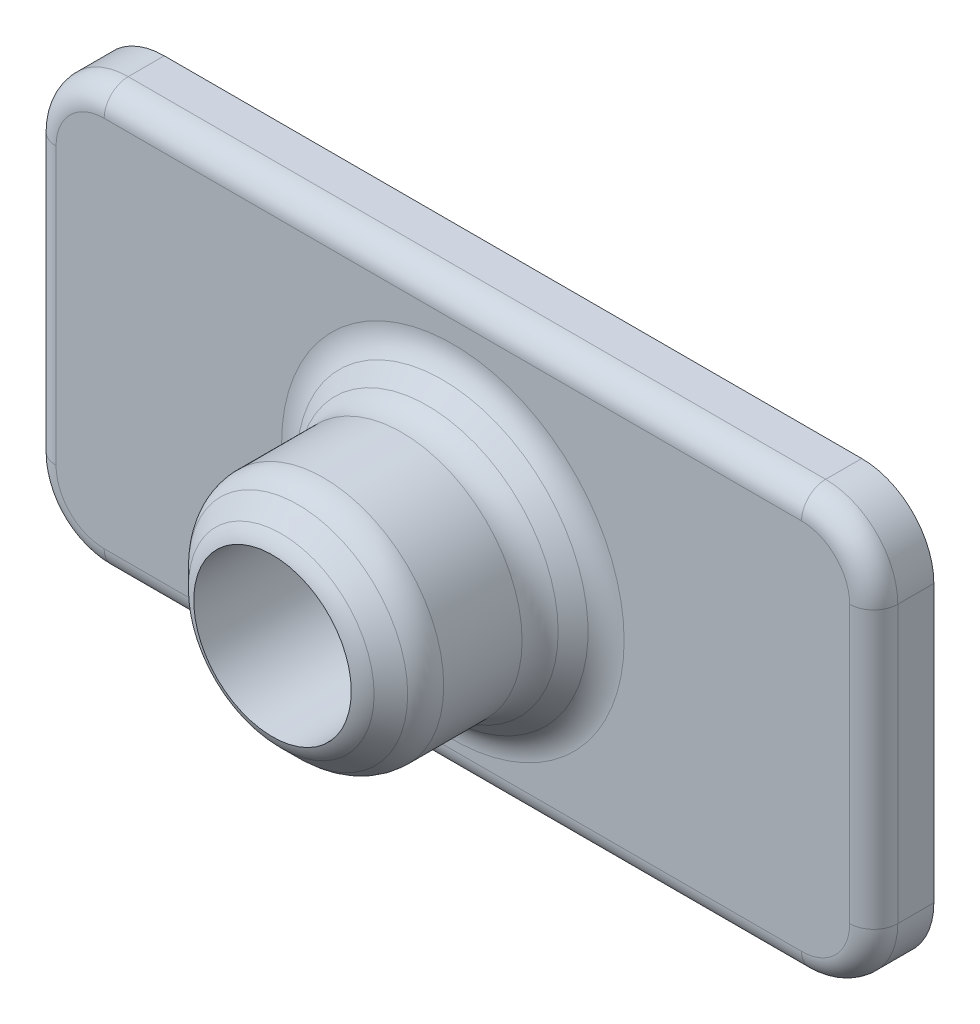
ISO-10303-21;
HEADER;
FILE_DESCRIPTION(('STEP AP214'),'2;1');
FILE_NAME('part.step','',(''),(''),'','','');
FILE_SCHEMA(('AUTOMOTIVE_DESIGN { 1 0 10303 214 1 1 1 1 }'));
ENDSEC;
DATA;
#1=APPLICATION_CONTEXT('core data for automotive mechanical design processes');
#2=APPLICATION_PROTOCOL_DEFINITION('international standard','automotive_design',2000,#1);
#3=PRODUCT_CONTEXT('',#1,'mechanical');
#4=PRODUCT('Part','Part','',(#3));
#5=PRODUCT_RELATED_PRODUCT_CATEGORY('part','',(#4));
#6=PRODUCT_DEFINITION_FORMATION('','',#4);
#7=PRODUCT_DEFINITION_CONTEXT('part definition',#1,'design');
#8=PRODUCT_DEFINITION('design','',#6,#7);
#9=PRODUCT_DEFINITION_SHAPE('','',#8);
#10=(LENGTH_UNIT() NAMED_UNIT(*) SI_UNIT(.MILLI.,.METRE.));
#11=(NAMED_UNIT(*) PLANE_ANGLE_UNIT() SI_UNIT($,.RADIAN.));
#12=(NAMED_UNIT(*) SI_UNIT($,.STERADIAN.) SOLID_ANGLE_UNIT());
#13=UNCERTAINTY_MEASURE_WITH_UNIT(LENGTH_MEASURE(1.E-05),#10,'distance_accuracy_value','');
#14=(GEOMETRIC_REPRESENTATION_CONTEXT(3) GLOBAL_UNCERTAINTY_ASSIGNED_CONTEXT((#13)) GLOBAL_UNIT_ASSIGNED_CONTEXT((#10,
#11,#12)) REPRESENTATION_CONTEXT('',''));
#15=CARTESIAN_POINT('',(0.,0.,0.));
#16=DIRECTION('',(0.,0.,1.));
#17=DIRECTION('',(1.,0.,0.));
#18=AXIS2_PLACEMENT_3D('',#15,#16,#17);
#19=CARTESIAN_POINT('',(-115.000000000002,-75.0000000000001,5.));
#20=DIRECTION('',(1.,0.,0.));
#21=DIRECTION('',(0.,0.,-1.));
#22=AXIS2_PLACEMENT_3D('',#19,#20,#21);
#23=PLANE('',#22);
#24=DIRECTION('',(0.,0.,-1.));
#25=VECTOR('',#24,1.);
#26=CARTESIAN_POINT('',(-115.000000000002,-69.0000000000001,5.));
#27=LINE('',#26,#25);
#28=CARTESIAN_POINT('',(-115.000000000002,-69.0000000000001,0.));
#29=VERTEX_POINT('',#28);
#30=CARTESIAN_POINT('',(-115.000000000002,-69.0000000000001,3.));
#31=VERTEX_POINT('',#30);
#32=EDGE_CURVE('E177',#29,#31,#27,.F.);
#33=ORIENTED_EDGE('',*,*,#32,.T.);
#34=DIRECTION('',(0.,-1.,0.));
#35=VECTOR('',#34,1.);
#36=CARTESIAN_POINT('',(-115.000000000002,-75.0000000000001,3.));
#37=LINE('',#36,#35);
#38=CARTESIAN_POINT('',(-115.000000000002,-46.0000000000001,3.));
#39=VERTEX_POINT('',#38);
#40=EDGE_CURVE('E11',#31,#39,#37,.F.);
#41=ORIENTED_EDGE('',*,*,#40,.T.);
#42=DIRECTION('',(0.,0.,-1.));
#43=VECTOR('',#42,1.);
#44=CARTESIAN_POINT('',(-115.000000000002,-46.0000000000001,5.));
#45=LINE('',#44,#43);
#46=CARTESIAN_POINT('',(-115.000000000002,-46.0000000000001,0.));
#47=VERTEX_POINT('',#46);
#48=EDGE_CURVE('E175',#39,#47,#45,.T.);
#49=ORIENTED_EDGE('',*,*,#48,.T.);
#50=DIRECTION('',(0.,-1.,0.));
#51=VECTOR('',#50,1.);
#52=CARTESIAN_POINT('',(-115.000000000002,-75.0000000000001,0.));
#53=LINE('',#52,#51);
#54=EDGE_CURVE('E261',#47,#29,#53,.T.);
#55=ORIENTED_EDGE('',*,*,#54,.T.);
#56=EDGE_LOOP('',(#33,#41,#49,#55));
#57=FACE_BOUND('',#56,.T.);
#58=ADVANCED_FACE('F39',(#57),#23,.F.);
#59=CARTESIAN_POINT('',(-115.000000000002,-75.0000000000001,5.));
#60=DIRECTION('',(0.,1.,0.));
#61=DIRECTION('',(0.,0.,1.));
#62=AXIS2_PLACEMENT_3D('',#59,#60,#61);
#63=PLANE('',#62);
#64=DIRECTION('',(0.,0.,-1.));
#65=VECTOR('',#64,1.);
#66=CARTESIAN_POINT('',(-51.0000000000018,-75.0000000000001,5.));
#67=LINE('',#66,#65);
#68=CARTESIAN_POINT('',(-51.0000000000018,-75.0000000000001,0.));
#69=VERTEX_POINT('',#68);
#70=CARTESIAN_POINT('',(-51.0000000000018,-75.0000000000001,3.));
#71=VERTEX_POINT('',#70);
#72=EDGE_CURVE('E173',#69,#71,#67,.F.);
#73=ORIENTED_EDGE('',*,*,#72,.T.);
#74=DIRECTION('',(1.,0.,0.));
#75=VECTOR('',#74,1.);
#76=CARTESIAN_POINT('',(-115.000000000002,-75.0000000000001,3.));
#77=LINE('',#76,#75);
#78=CARTESIAN_POINT('',(-109.000000000002,-75.0000000000001,3.));
#79=VERTEX_POINT('',#78);
#80=EDGE_CURVE('E63',#71,#79,#77,.F.);
#81=ORIENTED_EDGE('',*,*,#80,.T.);
#82=DIRECTION('',(0.,0.,-1.));
#83=VECTOR('',#82,1.);
#84=CARTESIAN_POINT('',(-109.000000000002,-75.0000000000001,5.));
#85=LINE('',#84,#83);
#86=CARTESIAN_POINT('',(-109.000000000002,-75.0000000000001,0.));
#87=VERTEX_POINT('',#86);
#88=EDGE_CURVE('E171',#79,#87,#85,.T.);
#89=ORIENTED_EDGE('',*,*,#88,.T.);
#90=DIRECTION('',(1.,0.,0.));
#91=VECTOR('',#90,1.);
#92=CARTESIAN_POINT('',(-115.000000000002,-75.0000000000001,0.));
#93=LINE('',#92,#91);
#94=EDGE_CURVE('E161',#87,#69,#93,.T.);
#95=ORIENTED_EDGE('',*,*,#94,.T.);
#96=EDGE_LOOP('',(#73,#81,#89,#95));
#97=FACE_BOUND('',#96,.T.);
#98=ADVANCED_FACE('F268',(#97),#63,.F.);
#99=CARTESIAN_POINT('',(-45.0000000000018,-40.0000000000001,5.));
#100=DIRECTION('',(-1.,0.,0.));
#101=DIRECTION('',(0.,0.,1.));
#102=AXIS2_PLACEMENT_3D('',#99,#100,#101);
#103=PLANE('',#102);
#104=DIRECTION('',(0.,0.,-1.));
#105=VECTOR('',#104,1.);
#106=CARTESIAN_POINT('',(-45.0000000000018,-46.0000000000001,5.));
#107=LINE('',#106,#105);
#108=CARTESIAN_POINT('',(-45.0000000000018,-46.0000000000001,0.));
#109=VERTEX_POINT('',#108);
#110=CARTESIAN_POINT('',(-45.0000000000018,-46.0000000000001,3.));
#111=VERTEX_POINT('',#110);
#112=EDGE_CURVE('E148',#109,#111,#107,.F.);
#113=ORIENTED_EDGE('',*,*,#112,.T.);
#114=DIRECTION('',(0.,1.,0.));
#115=VECTOR('',#114,1.);
#116=CARTESIAN_POINT('',(-45.0000000000018,-40.0000000000001,3.));
#117=LINE('',#116,#115);
#118=CARTESIAN_POINT('',(-45.0000000000018,-69.0000000000001,3.));
#119=VERTEX_POINT('',#118);
#120=EDGE_CURVE('E223',#111,#119,#117,.F.);
#121=ORIENTED_EDGE('',*,*,#120,.T.);
#122=DIRECTION('',(0.,0.,-1.));
#123=VECTOR('',#122,1.);
#124=CARTESIAN_POINT('',(-45.0000000000018,-69.0000000000001,5.));
#125=LINE('',#124,#123);
#126=CARTESIAN_POINT('',(-45.0000000000018,-69.0000000000001,0.));
#127=VERTEX_POINT('',#126);
#128=EDGE_CURVE('E152',#119,#127,#125,.T.);
#129=ORIENTED_EDGE('',*,*,#128,.T.);
#130=DIRECTION('',(0.,1.,0.));
#131=VECTOR('',#130,1.);
#132=CARTESIAN_POINT('',(-45.0000000000018,-40.0000000000001,0.));
#133=LINE('',#132,#131);
#134=EDGE_CURVE('E158',#127,#109,#133,.T.);
#135=ORIENTED_EDGE('',*,*,#134,.T.);
#136=EDGE_LOOP('',(#113,#121,#129,#135));
#137=FACE_BOUND('',#136,.T.);
#138=ADVANCED_FACE('F306',(#137),#103,.F.);
#139=CARTESIAN_POINT('',(-115.000000000002,-40.0000000000001,5.));
#140=DIRECTION('',(0.,-1.,0.));
#141=DIRECTION('',(0.,0.,-1.));
#142=AXIS2_PLACEMENT_3D('',#139,#140,#141);
#143=PLANE('',#142);
#144=DIRECTION('',(0.,0.,-1.));
#145=VECTOR('',#144,1.);
#146=CARTESIAN_POINT('',(-109.000000000002,-40.0000000000001,5.));
#147=LINE('',#146,#145);
#148=CARTESIAN_POINT('',(-109.000000000002,-40.0000000000001,0.));
#149=VERTEX_POINT('',#148);
#150=CARTESIAN_POINT('',(-109.000000000002,-40.0000000000001,3.));
#151=VERTEX_POINT('',#150);
#152=EDGE_CURVE('E142',#149,#151,#147,.F.);
#153=ORIENTED_EDGE('',*,*,#152,.T.);
#154=DIRECTION('',(-1.,0.,0.));
#155=VECTOR('',#154,1.);
#156=CARTESIAN_POINT('',(-115.000000000002,-40.0000000000001,3.));
#157=LINE('',#156,#155);
#158=CARTESIAN_POINT('',(-51.0000000000018,-40.0000000000001,3.));
#159=VERTEX_POINT('',#158);
#160=EDGE_CURVE('E138',#151,#159,#157,.F.);
#161=ORIENTED_EDGE('',*,*,#160,.T.);
#162=DIRECTION('',(0.,0.,-1.));
#163=VECTOR('',#162,1.);
#164=CARTESIAN_POINT('',(-51.0000000000018,-40.0000000000001,5.));
#165=LINE('',#164,#163);
#166=CARTESIAN_POINT('',(-51.0000000000018,-40.0000000000001,0.));
#167=VERTEX_POINT('',#166);
#168=EDGE_CURVE('E130',#159,#167,#165,.T.);
#169=ORIENTED_EDGE('',*,*,#168,.T.);
#170=DIRECTION('',(-1.,0.,0.));
#171=VECTOR('',#170,1.);
#172=CARTESIAN_POINT('',(-115.000000000002,-40.0000000000001,0.));
#173=LINE('',#172,#171);
#174=EDGE_CURVE('E135',#167,#149,#173,.T.);
#175=ORIENTED_EDGE('',*,*,#174,.T.);
#176=EDGE_LOOP('',(#153,#161,#169,#175));
#177=FACE_BOUND('',#176,.T.);
#178=ADVANCED_FACE('F133',(#177),#143,.F.);
#179=CARTESIAN_POINT('',(0.,0.,5.));
#180=DIRECTION('',(0.,0.,-1.));
#181=DIRECTION('',(-1.,0.,0.));
#182=AXIS2_PLACEMENT_3D('',#179,#180,#181);
#183=PLANE('',#182);
#184=DIRECTION('',(-1.,0.,0.));
#185=VECTOR('',#184,1.);
#186=CARTESIAN_POINT('',(0.,-42.0000000000001,5.));
#187=LINE('',#186,#185);
#188=CARTESIAN_POINT('',(-51.0000000000018,-42.0000000000001,5.));
#189=VERTEX_POINT('',#188);
#190=CARTESIAN_POINT('',(-109.000000000002,-42.0000000000001,5.));
#191=VERTEX_POINT('',#190);
#192=EDGE_CURVE('E212',#189,#191,#187,.T.);
#193=ORIENTED_EDGE('',*,*,#192,.T.);
#194=CARTESIAN_POINT('',(-109.000000000002,-46.0000000000001,5.));
#195=DIRECTION('',(0.,0.,-1.));
#196=DIRECTION('',(-1.,0.,0.));
#197=AXIS2_PLACEMENT_3D('',#194,#195,#196);
#198=CIRCLE('',#197,4.);
#199=CARTESIAN_POINT('',(-113.000000000002,-46.0000000000001,5.));
#200=VERTEX_POINT('',#199);
#201=EDGE_CURVE('E214',#191,#200,#198,.F.);
#202=ORIENTED_EDGE('',*,*,#201,.T.);
#203=DIRECTION('',(0.,-1.,0.));
#204=VECTOR('',#203,1.);
#205=CARTESIAN_POINT('',(-113.000000000002,0.,5.));
#206=LINE('',#205,#204);
#207=CARTESIAN_POINT('',(-113.000000000002,-69.0000000000001,5.));
#208=VERTEX_POINT('',#207);
#209=EDGE_CURVE('E200',#200,#208,#206,.T.);
#210=ORIENTED_EDGE('',*,*,#209,.T.);
#211=CARTESIAN_POINT('',(-109.000000000002,-69.0000000000001,5.));
#212=DIRECTION('',(0.,0.,-1.));
#213=DIRECTION('',(-1.,0.,0.));
#214=AXIS2_PLACEMENT_3D('',#211,#212,#213);
#215=CIRCLE('',#214,4.);
#216=CARTESIAN_POINT('',(-109.000000000002,-73.0000000000001,5.));
#217=VERTEX_POINT('',#216);
#218=EDGE_CURVE('E202',#208,#217,#215,.F.);
#219=ORIENTED_EDGE('',*,*,#218,.T.);
#220=DIRECTION('',(1.,0.,0.));
#221=VECTOR('',#220,1.);
#222=CARTESIAN_POINT('',(0.,-73.0000000000001,5.));
#223=LINE('',#222,#221);
#224=CARTESIAN_POINT('',(-51.0000000000018,-73.0000000000001,5.));
#225=VERTEX_POINT('',#224);
#226=EDGE_CURVE('E204',#217,#225,#223,.T.);
#227=ORIENTED_EDGE('',*,*,#226,.T.);
#228=CARTESIAN_POINT('',(-51.0000000000018,-69.0000000000001,5.));
#229=DIRECTION('',(0.,0.,-1.));
#230=DIRECTION('',(-1.,0.,0.));
#231=AXIS2_PLACEMENT_3D('',#228,#229,#230);
#232=CIRCLE('',#231,4.);
#233=CARTESIAN_POINT('',(-47.0000000000018,-69.0000000000001,5.));
#234=VERTEX_POINT('',#233);
#235=EDGE_CURVE('E206',#225,#234,#232,.F.);
#236=ORIENTED_EDGE('',*,*,#235,.T.);
#237=DIRECTION('',(0.,1.,0.));
#238=VECTOR('',#237,1.);
#239=CARTESIAN_POINT('',(-47.0000000000018,0.,5.));
#240=LINE('',#239,#238);
#241=CARTESIAN_POINT('',(-47.0000000000018,-46.0000000000001,5.));
#242=VERTEX_POINT('',#241);
#243=EDGE_CURVE('E208',#234,#242,#240,.T.);
#244=ORIENTED_EDGE('',*,*,#243,.T.);
#245=CARTESIAN_POINT('',(-51.0000000000018,-46.0000000000001,5.));
#246=DIRECTION('',(0.,0.,-1.));
#247=DIRECTION('',(-1.,0.,0.));
#248=AXIS2_PLACEMENT_3D('',#245,#246,#247);
#249=CIRCLE('',#248,4.);
#250=EDGE_CURVE('E210',#242,#189,#249,.F.);
#251=ORIENTED_EDGE('',*,*,#250,.T.);
#252=EDGE_LOOP('',(#193,#202,#210,#219,#227,#236,#244,#251));
#253=FACE_BOUND('',#252,.T.);
#254=CARTESIAN_POINT('',(-80.0000000000018,-58.0000000000001,5.));
#255=DIRECTION('',(0.,0.,-1.));
#256=DIRECTION('',(-1.,0.,0.));
#257=AXIS2_PLACEMENT_3D('',#254,#255,#256);
#258=CIRCLE('',#257,14.2426406871193);
#259=CARTESIAN_POINT('',(-94.2426406871211,-58.0000000000001,5.));
#260=VERTEX_POINT('',#259);
#261=EDGE_CURVE('E191',#260,#260,#258,.T.);
#262=ORIENTED_EDGE('',*,*,#261,.T.);
#263=EDGE_LOOP('',(#262));
#264=FACE_BOUND('',#263,.T.);
#265=ADVANCED_FACE('F309',(#253,#264),#183,.F.);
#266=CARTESIAN_POINT('',(0.,0.,0.));
#267=DIRECTION('',(0.,0.,-1.));
#268=DIRECTION('',(-1.,0.,0.));
#269=AXIS2_PLACEMENT_3D('',#266,#267,#268);
#270=PLANE('',#269);
#271=ORIENTED_EDGE('',*,*,#174,.F.);
#272=CARTESIAN_POINT('',(-51.0000000000018,-46.0000000000001,0.));
#273=DIRECTION('',(0.,0.,-1.));
#274=DIRECTION('',(-1.,0.,0.));
#275=AXIS2_PLACEMENT_3D('',#272,#273,#274);
#276=CIRCLE('',#275,6.);
#277=EDGE_CURVE('E145',#167,#109,#276,.T.);
#278=ORIENTED_EDGE('',*,*,#277,.T.);
#279=ORIENTED_EDGE('',*,*,#134,.F.);
#280=CARTESIAN_POINT('',(-51.0000000000018,-69.0000000000001,0.));
#281=DIRECTION('',(0.,0.,-1.));
#282=DIRECTION('',(-1.,0.,0.));
#283=AXIS2_PLACEMENT_3D('',#280,#281,#282);
#284=CIRCLE('',#283,6.);
#285=EDGE_CURVE('E153',#127,#69,#284,.T.);
#286=ORIENTED_EDGE('',*,*,#285,.T.);
#287=ORIENTED_EDGE('',*,*,#94,.F.);
#288=CARTESIAN_POINT('',(-109.000000000002,-69.0000000000001,0.));
#289=DIRECTION('',(0.,0.,-1.));
#290=DIRECTION('',(-1.,0.,0.));
#291=AXIS2_PLACEMENT_3D('',#288,#289,#290);
#292=CIRCLE('',#291,6.);
#293=EDGE_CURVE('E166',#87,#29,#292,.T.);
#294=ORIENTED_EDGE('',*,*,#293,.T.);
#295=ORIENTED_EDGE('',*,*,#54,.F.);
#296=CARTESIAN_POINT('',(-109.000000000002,-46.0000000000001,0.));
#297=DIRECTION('',(0.,0.,-1.));
#298=DIRECTION('',(-1.,0.,0.));
#299=AXIS2_PLACEMENT_3D('',#296,#297,#298);
#300=CIRCLE('',#299,6.);
#301=EDGE_CURVE('E141',#47,#149,#300,.T.);
#302=ORIENTED_EDGE('',*,*,#301,.T.);
#303=EDGE_LOOP('',(#271,#278,#279,#286,#287,#294,#295,#302));
#304=FACE_BOUND('',#303,.T.);
#305=ADVANCED_FACE('F155',(#304),#270,.T.);
#306=CARTESIAN_POINT('',(-51.0000000000018,-46.0000000000001,5.));
#307=DIRECTION('',(0.,0.,-1.));
#308=DIRECTION('',(-1.,0.,0.));
#309=AXIS2_PLACEMENT_3D('',#306,#307,#308);
#310=CYLINDRICAL_SURFACE('',#309,6.);
#311=ORIENTED_EDGE('',*,*,#168,.F.);
#312=CARTESIAN_POINT('',(-51.0000000000018,-46.0000000000001,3.));
#313=DIRECTION('',(0.,0.,-1.));
#314=DIRECTION('',(-1.,0.,0.));
#315=AXIS2_PLACEMENT_3D('',#312,#313,#314);
#316=CIRCLE('',#315,6.);
#317=EDGE_CURVE('E221',#159,#111,#316,.T.);
#318=ORIENTED_EDGE('',*,*,#317,.T.);
#319=ORIENTED_EDGE('',*,*,#112,.F.);
#320=ORIENTED_EDGE('',*,*,#277,.F.);
#321=EDGE_LOOP('',(#311,#318,#319,#320));
#322=FACE_BOUND('',#321,.T.);
#323=ADVANCED_FACE('F146',(#322),#310,.T.);
#324=CARTESIAN_POINT('',(-51.0000000000018,-69.0000000000001,5.));
#325=DIRECTION('',(0.,0.,-1.));
#326=DIRECTION('',(-1.,0.,0.));
#327=AXIS2_PLACEMENT_3D('',#324,#325,#326);
#328=CYLINDRICAL_SURFACE('',#327,6.);
#329=ORIENTED_EDGE('',*,*,#128,.F.);
#330=CARTESIAN_POINT('',(-51.0000000000018,-69.0000000000001,3.));
#331=DIRECTION('',(0.,0.,-1.));
#332=DIRECTION('',(-1.,0.,0.));
#333=AXIS2_PLACEMENT_3D('',#330,#331,#332);
#334=CIRCLE('',#333,6.);
#335=EDGE_CURVE('E225',#119,#71,#334,.T.);
#336=ORIENTED_EDGE('',*,*,#335,.T.);
#337=ORIENTED_EDGE('',*,*,#72,.F.);
#338=ORIENTED_EDGE('',*,*,#285,.F.);
#339=EDGE_LOOP('',(#329,#336,#337,#338));
#340=FACE_BOUND('',#339,.T.);
#341=ADVANCED_FACE('F273',(#340),#328,.T.);
#342=CARTESIAN_POINT('',(-109.000000000002,-69.0000000000001,5.));
#343=DIRECTION('',(0.,0.,-1.));
#344=DIRECTION('',(-1.,0.,0.));
#345=AXIS2_PLACEMENT_3D('',#342,#343,#344);
#346=CYLINDRICAL_SURFACE('',#345,6.);
#347=ORIENTED_EDGE('',*,*,#88,.F.);
#348=CARTESIAN_POINT('',(-109.000000000002,-69.0000000000001,3.));
#349=DIRECTION('',(0.,0.,-1.));
#350=DIRECTION('',(-1.,0.,0.));
#351=AXIS2_PLACEMENT_3D('',#348,#349,#350);
#352=CIRCLE('',#351,6.);
#353=EDGE_CURVE('E48',#79,#31,#352,.T.);
#354=ORIENTED_EDGE('',*,*,#353,.T.);
#355=ORIENTED_EDGE('',*,*,#32,.F.);
#356=ORIENTED_EDGE('',*,*,#293,.F.);
#357=EDGE_LOOP('',(#347,#354,#355,#356));
#358=FACE_BOUND('',#357,.T.);
#359=ADVANCED_FACE('F344',(#358),#346,.T.);
#360=CARTESIAN_POINT('',(-109.000000000002,-46.0000000000001,5.));
#361=DIRECTION('',(0.,0.,-1.));
#362=DIRECTION('',(-1.,0.,0.));
#363=AXIS2_PLACEMENT_3D('',#360,#361,#362);
#364=CYLINDRICAL_SURFACE('',#363,6.);
#365=ORIENTED_EDGE('',*,*,#48,.F.);
#366=CARTESIAN_POINT('',(-109.000000000002,-46.0000000000001,3.));
#367=DIRECTION('',(0.,0.,-1.));
#368=DIRECTION('',(-1.,0.,0.));
#369=AXIS2_PLACEMENT_3D('',#366,#367,#368);
#370=CIRCLE('',#369,6.);
#371=EDGE_CURVE('E217',#39,#151,#370,.T.);
#372=ORIENTED_EDGE('',*,*,#371,.T.);
#373=ORIENTED_EDGE('',*,*,#152,.F.);
#374=ORIENTED_EDGE('',*,*,#301,.F.);
#375=EDGE_LOOP('',(#365,#372,#373,#374));
#376=FACE_BOUND('',#375,.T.);
#377=ADVANCED_FACE('F292',(#376),#364,.T.);
#378=CARTESIAN_POINT('',(-80.0000000000018,-58.0000000000001,20.));
#379=DIRECTION('',(0.,0.,-1.));
#380=DIRECTION('',(-1.,0.,0.));
#381=AXIS2_PLACEMENT_3D('',#378,#379,#380);
#382=CYLINDRICAL_SURFACE('',#381,9.99999999999999);
#383=CARTESIAN_POINT('',(-80.0000000000018,-58.0000000000001,15.7573593128807));
#384=DIRECTION('',(0.,0.,1.));
#385=DIRECTION('',(1.,0.,0.));
#386=AXIS2_PLACEMENT_3D('',#383,#384,#385);
#387=CIRCLE('',#386,9.99999999999999);
#388=CARTESIAN_POINT('',(-70.0000000000018,-58.0000000000001,15.7573593128807));
#389=VERTEX_POINT('',#388);
#390=EDGE_CURVE('E188',#389,#389,#387,.F.);
#391=ORIENTED_EDGE('',*,*,#390,.T.);
#392=EDGE_LOOP('',(#391));
#393=FACE_BOUND('',#392,.T.);
#394=CARTESIAN_POINT('',(-80.0000000000018,-58.0000000000001,9.24264068711929));
#395=DIRECTION('',(0.,0.,1.));
#396=DIRECTION('',(1.,0.,0.));
#397=AXIS2_PLACEMENT_3D('',#394,#395,#396);
#398=CIRCLE('',#397,9.99999999999999);
#399=CARTESIAN_POINT('',(-70.0000000000018,-58.0000000000001,9.24264068711929));
#400=VERTEX_POINT('',#399);
#401=EDGE_CURVE('E185',#400,#400,#398,.T.);
#402=ORIENTED_EDGE('',*,*,#401,.T.);
#403=EDGE_LOOP('',(#402));
#404=FACE_BOUND('',#403,.T.);
#405=ADVANCED_FACE('F349',(#393,#404),#382,.T.);
#406=CARTESIAN_POINT('',(-80.0000000000018,-58.0000000000001,20.));
#407=DIRECTION('',(0.,0.,-1.));
#408=DIRECTION('',(-1.,0.,0.));
#409=AXIS2_PLACEMENT_3D('',#406,#407,#408);
#410=CYLINDRICAL_SURFACE('',#409,6.55);
#411=CARTESIAN_POINT('',(-80.0000000000018,-58.0000000000001,20.));
#412=DIRECTION('',(0.,0.,1.));
#413=DIRECTION('',(1.,0.,0.));
#414=AXIS2_PLACEMENT_3D('',#411,#412,#413);
#415=CIRCLE('',#414,6.55);
#416=CARTESIAN_POINT('',(-73.4500000000019,-58.0000000000001,20.));
#417=VERTEX_POINT('',#416);
#418=EDGE_CURVE('E256',#417,#417,#415,.T.);
#419=ORIENTED_EDGE('',*,*,#418,.T.);
#420=EDGE_LOOP('',(#419));
#421=FACE_BOUND('',#420,.T.);
#422=CARTESIAN_POINT('',(-80.0000000000018,-58.0000000000001,5.));
#423=DIRECTION('',(0.,0.,1.));
#424=DIRECTION('',(1.,0.,0.));
#425=AXIS2_PLACEMENT_3D('',#422,#423,#424);
#426=CIRCLE('',#425,6.55);
#427=CARTESIAN_POINT('',(-73.4500000000019,-58.0000000000001,5.));
#428=VERTEX_POINT('',#427);
#429=EDGE_CURVE('E250',#428,#428,#426,.T.);
#430=ORIENTED_EDGE('',*,*,#429,.F.);
#431=EDGE_LOOP('',(#430));
#432=FACE_BOUND('',#431,.T.);
#433=ADVANCED_FACE('F372',(#421,#432),#410,.F.);
#434=ORIENTED_EDGE('',*,*,#429,.T.);
#435=EDGE_LOOP('',(#434));
#436=FACE_BOUND('',#435,.T.);
#437=ADVANCED_FACE('F313',(#436),#183,.F.);
#438=CARTESIAN_POINT('',(-80.0000000000018,-58.0000000000001,20.));
#439=DIRECTION('',(0.,0.,-1.));
#440=DIRECTION('',(-1.,0.,0.));
#441=AXIS2_PLACEMENT_3D('',#438,#439,#440);
#442=CONICAL_SURFACE('',#441,7.00000000000001,0.785398163397444);
#443=CARTESIAN_POINT('',(-80.0000000000018,-58.0000000000001,19.2742270751637));
#444=DIRECTION('',(0.,0.,-1.));
#445=DIRECTION('',(-1.,0.,0.));
#446=AXIS2_PLACEMENT_3D('',#443,#444,#445);
#447=CIRCLE('',#446,7.72577292483635);
#448=CARTESIAN_POINT('',(-87.7257729248382,-58.0000000000001,19.2742270751637));
#449=VERTEX_POINT('',#448);
#450=EDGE_CURVE('E182',#449,#449,#447,.T.);
#451=ORIENTED_EDGE('',*,*,#450,.T.);
#452=EDGE_LOOP('',(#451));
#453=FACE_BOUND('',#452,.T.);
#454=CARTESIAN_POINT('',(-80.0000000000018,-58.0000000000001,17.8786796564403));
#455=DIRECTION('',(0.,0.,-1.));
#456=DIRECTION('',(-1.,0.,0.));
#457=AXIS2_PLACEMENT_3D('',#454,#455,#456);
#458=CIRCLE('',#457,9.12132034355964);
#459=CARTESIAN_POINT('',(-89.1213203435615,-58.0000000000001,17.8786796564403));
#460=VERTEX_POINT('',#459);
#461=EDGE_CURVE('E179',#460,#460,#458,.F.);
#462=ORIENTED_EDGE('',*,*,#461,.T.);
#463=EDGE_LOOP('',(#462));
#464=FACE_BOUND('',#463,.T.);
#465=ADVANCED_FACE('F351',(#453,#464),#442,.T.);
#466=CARTESIAN_POINT('',(-80.0000000000018,-58.0000000000001,8.00000000000002));
#467=DIRECTION('',(0.,0.,-1.));
#468=DIRECTION('',(-1.,0.,0.));
#469=AXIS2_PLACEMENT_3D('',#466,#467,#468);
#470=CONICAL_SURFACE('',#469,9.99999999999999,0.785398163397444);
#471=CARTESIAN_POINT('',(-80.0000000000018,-58.0000000000001,5.87867965644037));
#472=DIRECTION('',(0.,0.,-1.));
#473=DIRECTION('',(-1.,0.,0.));
#474=AXIS2_PLACEMENT_3D('',#471,#472,#473);
#475=CIRCLE('',#474,12.1213203435596);
#476=CARTESIAN_POINT('',(-92.1213203435615,-58.0000000000001,5.87867965644037));
#477=VERTEX_POINT('',#476);
#478=EDGE_CURVE('E197',#477,#477,#475,.F.);
#479=ORIENTED_EDGE('',*,*,#478,.T.);
#480=EDGE_LOOP('',(#479));
#481=FACE_BOUND('',#480,.T.);
#482=CARTESIAN_POINT('',(-80.0000000000018,-58.0000000000001,7.12132034355966));
#483=DIRECTION('',(0.,0.,-1.));
#484=DIRECTION('',(-1.,0.,0.));
#485=AXIS2_PLACEMENT_3D('',#482,#483,#484);
#486=CIRCLE('',#485,10.8786796564403);
#487=CARTESIAN_POINT('',(-90.8786796564422,-58.0000000000001,7.12132034355966));
#488=VERTEX_POINT('',#487);
#489=EDGE_CURVE('E194',#488,#488,#486,.T.);
#490=ORIENTED_EDGE('',*,*,#489,.T.);
#491=EDGE_LOOP('',(#490));
#492=FACE_BOUND('',#491,.T.);
#493=ADVANCED_FACE('F357',(#481,#492),#470,.T.);
#494=CARTESIAN_POINT('',(-80.0000000000018,-58.0000000000001,17.152906731604));
#495=DIRECTION('',(0.,0.,1.));
#496=DIRECTION('',(1.,0.,0.));
#497=AXIS2_PLACEMENT_3D('',#494,#495,#496);
#498=TOROIDAL_SURFACE('',#497,5.6044525812767,3.);
#499=ORIENTED_EDGE('',*,*,#450,.F.);
#500=EDGE_LOOP('',(#499));
#501=FACE_BOUND('',#500,.T.);
#502=ORIENTED_EDGE('',*,*,#418,.F.);
#503=EDGE_LOOP('',(#502));
#504=FACE_BOUND('',#503,.T.);
#505=ADVANCED_FACE('F328',(#501,#504),#498,.T.);
#506=CARTESIAN_POINT('',(-80.0000000000018,-58.0000000000001,15.7573593128807));
#507=DIRECTION('',(0.,0.,1.));
#508=DIRECTION('',(1.,0.,0.));
#509=AXIS2_PLACEMENT_3D('',#506,#507,#508);
#510=TOROIDAL_SURFACE('',#509,6.99999999999999,3.);
#511=ORIENTED_EDGE('',*,*,#461,.F.);
#512=EDGE_LOOP('',(#511));
#513=FACE_BOUND('',#512,.T.);
#514=ORIENTED_EDGE('',*,*,#390,.F.);
#515=EDGE_LOOP('',(#514));
#516=FACE_BOUND('',#515,.T.);
#517=ADVANCED_FACE('F319',(#513,#516),#510,.T.);
#518=CARTESIAN_POINT('',(-80.0000000000018,-58.0000000000001,8.));
#519=DIRECTION('',(0.,0.,-1.));
#520=DIRECTION('',(-1.,0.,0.));
#521=AXIS2_PLACEMENT_3D('',#518,#519,#520);
#522=TOROIDAL_SURFACE('',#521,14.2426406871193,3.);
#523=ORIENTED_EDGE('',*,*,#478,.F.);
#524=EDGE_LOOP('',(#523));
#525=FACE_BOUND('',#524,.T.);
#526=ORIENTED_EDGE('',*,*,#261,.F.);
#527=EDGE_LOOP('',(#526));
#528=FACE_BOUND('',#527,.T.);
#529=ADVANCED_FACE('F316',(#525,#528),#522,.F.);
#530=CARTESIAN_POINT('',(-80.0000000000018,-58.0000000000001,9.24264068711929));
#531=DIRECTION('',(0.,0.,1.));
#532=DIRECTION('',(1.,0.,0.));
#533=AXIS2_PLACEMENT_3D('',#530,#531,#532);
#534=TOROIDAL_SURFACE('',#533,13.,3.);
#535=ORIENTED_EDGE('',*,*,#489,.F.);
#536=EDGE_LOOP('',(#535));
#537=FACE_BOUND('',#536,.T.);
#538=ORIENTED_EDGE('',*,*,#401,.F.);
#539=EDGE_LOOP('',(#538));
#540=FACE_BOUND('',#539,.T.);
#541=ADVANCED_FACE('F318',(#537,#540),#534,.F.);
#542=CARTESIAN_POINT('',(-51.0000000000018,-69.0000000000001,3.));
#543=DIRECTION('',(0.,0.,-1.));
#544=DIRECTION('',(-1.,0.,0.));
#545=AXIS2_PLACEMENT_3D('',#542,#543,#544);
#546=TOROIDAL_SURFACE('',#545,4.,2.);
#547=CARTESIAN_POINT('',(-51.0000000000018,-73.0000000000001,3.));
#548=DIRECTION('',(-1.,0.,0.));
#549=DIRECTION('',(0.,0.,1.));
#550=AXIS2_PLACEMENT_3D('',#547,#548,#549);
#551=CIRCLE('',#550,2.);
#552=EDGE_CURVE('E244',#71,#225,#551,.T.);
#553=ORIENTED_EDGE('',*,*,#552,.F.);
#554=ORIENTED_EDGE('',*,*,#335,.F.);
#555=CARTESIAN_POINT('',(-47.0000000000018,-69.0000000000001,3.));
#556=DIRECTION('',(0.,1.,0.));
#557=DIRECTION('',(0.,0.,1.));
#558=AXIS2_PLACEMENT_3D('',#555,#556,#557);
#559=CIRCLE('',#558,2.);
#560=EDGE_CURVE('E43',#234,#119,#559,.T.);
#561=ORIENTED_EDGE('',*,*,#560,.F.);
#562=ORIENTED_EDGE('',*,*,#235,.F.);
#563=EDGE_LOOP('',(#553,#554,#561,#562));
#564=FACE_BOUND('',#563,.T.);
#565=ADVANCED_FACE('F41',(#564),#546,.T.);
#566=CARTESIAN_POINT('',(-47.0000000000018,0.,3.));
#567=DIRECTION('',(0.,1.,0.));
#568=DIRECTION('',(0.,0.,1.));
#569=AXIS2_PLACEMENT_3D('',#566,#567,#568);
#570=CYLINDRICAL_SURFACE('',#569,2.);
#571=ORIENTED_EDGE('',*,*,#560,.T.);
#572=ORIENTED_EDGE('',*,*,#120,.F.);
#573=CARTESIAN_POINT('',(-47.0000000000018,-46.0000000000001,3.));
#574=DIRECTION('',(0.,1.,0.));
#575=DIRECTION('',(0.,0.,1.));
#576=AXIS2_PLACEMENT_3D('',#573,#574,#575);
#577=CIRCLE('',#576,2.);
#578=EDGE_CURVE('E242',#242,#111,#577,.T.);
#579=ORIENTED_EDGE('',*,*,#578,.F.);
#580=ORIENTED_EDGE('',*,*,#243,.F.);
#581=EDGE_LOOP('',(#571,#572,#579,#580));
#582=FACE_BOUND('',#581,.T.);
#583=ADVANCED_FACE('F307',(#582),#570,.T.);
#584=CARTESIAN_POINT('',(0.,-73.0000000000001,3.));
#585=DIRECTION('',(1.,0.,0.));
#586=DIRECTION('',(0.,0.,-1.));
#587=AXIS2_PLACEMENT_3D('',#584,#585,#586);
#588=CYLINDRICAL_SURFACE('',#587,2.);
#589=ORIENTED_EDGE('',*,*,#552,.T.);
#590=ORIENTED_EDGE('',*,*,#226,.F.);
#591=CARTESIAN_POINT('',(-109.000000000002,-73.0000000000001,3.));
#592=DIRECTION('',(-1.,0.,0.));
#593=DIRECTION('',(0.,0.,1.));
#594=AXIS2_PLACEMENT_3D('',#591,#592,#593);
#595=CIRCLE('',#594,2.);
#596=EDGE_CURVE('E239',#79,#217,#595,.T.);
#597=ORIENTED_EDGE('',*,*,#596,.F.);
#598=ORIENTED_EDGE('',*,*,#80,.F.);
#599=EDGE_LOOP('',(#589,#590,#597,#598));
#600=FACE_BOUND('',#599,.T.);
#601=ADVANCED_FACE('F278',(#600),#588,.T.);
#602=CARTESIAN_POINT('',(-51.0000000000018,-46.0000000000001,3.));
#603=DIRECTION('',(0.,0.,-1.));
#604=DIRECTION('',(-1.,0.,0.));
#605=AXIS2_PLACEMENT_3D('',#602,#603,#604);
#606=TOROIDAL_SURFACE('',#605,4.,2.);
#607=ORIENTED_EDGE('',*,*,#578,.T.);
#608=ORIENTED_EDGE('',*,*,#317,.F.);
#609=CARTESIAN_POINT('',(-51.0000000000018,-42.0000000000001,3.));
#610=DIRECTION('',(-1.,0.,0.));
#611=DIRECTION('',(0.,0.,1.));
#612=AXIS2_PLACEMENT_3D('',#609,#610,#611);
#613=CIRCLE('',#612,2.);
#614=EDGE_CURVE('E236',#189,#159,#613,.T.);
#615=ORIENTED_EDGE('',*,*,#614,.F.);
#616=ORIENTED_EDGE('',*,*,#250,.F.);
#617=EDGE_LOOP('',(#607,#608,#615,#616));
#618=FACE_BOUND('',#617,.T.);
#619=ADVANCED_FACE('F303',(#618),#606,.T.);
#620=CARTESIAN_POINT('',(-109.000000000002,-69.0000000000001,3.));
#621=DIRECTION('',(0.,0.,-1.));
#622=DIRECTION('',(-1.,0.,0.));
#623=AXIS2_PLACEMENT_3D('',#620,#621,#622);
#624=TOROIDAL_SURFACE('',#623,4.,2.);
#625=ORIENTED_EDGE('',*,*,#596,.T.);
#626=ORIENTED_EDGE('',*,*,#218,.F.);
#627=CARTESIAN_POINT('',(-113.000000000002,-69.0000000000001,3.));
#628=DIRECTION('',(0.,1.,0.));
#629=DIRECTION('',(0.,0.,1.));
#630=AXIS2_PLACEMENT_3D('',#627,#628,#629);
#631=CIRCLE('',#630,2.);
#632=EDGE_CURVE('E233',#31,#208,#631,.T.);
#633=ORIENTED_EDGE('',*,*,#632,.F.);
#634=ORIENTED_EDGE('',*,*,#353,.F.);
#635=EDGE_LOOP('',(#625,#626,#633,#634));
#636=FACE_BOUND('',#635,.T.);
#637=ADVANCED_FACE('F282',(#636),#624,.T.);
#638=CARTESIAN_POINT('',(0.,-42.0000000000001,3.));
#639=DIRECTION('',(-1.,0.,0.));
#640=DIRECTION('',(0.,0.,1.));
#641=AXIS2_PLACEMENT_3D('',#638,#639,#640);
#642=CYLINDRICAL_SURFACE('',#641,2.);
#643=ORIENTED_EDGE('',*,*,#614,.T.);
#644=ORIENTED_EDGE('',*,*,#160,.F.);
#645=CARTESIAN_POINT('',(-109.000000000002,-42.0000000000001,3.));
#646=DIRECTION('',(-1.,0.,0.));
#647=DIRECTION('',(0.,0.,1.));
#648=AXIS2_PLACEMENT_3D('',#645,#646,#647);
#649=CIRCLE('',#648,2.);
#650=EDGE_CURVE('E231',#191,#151,#649,.T.);
#651=ORIENTED_EDGE('',*,*,#650,.F.);
#652=ORIENTED_EDGE('',*,*,#192,.F.);
#653=EDGE_LOOP('',(#643,#644,#651,#652));
#654=FACE_BOUND('',#653,.T.);
#655=ADVANCED_FACE('F299',(#654),#642,.T.);
#656=CARTESIAN_POINT('',(-113.000000000002,0.,3.));
#657=DIRECTION('',(0.,-1.,0.));
#658=DIRECTION('',(0.,0.,-1.));
#659=AXIS2_PLACEMENT_3D('',#656,#657,#658);
#660=CYLINDRICAL_SURFACE('',#659,2.);
#661=ORIENTED_EDGE('',*,*,#632,.T.);
#662=ORIENTED_EDGE('',*,*,#209,.F.);
#663=CARTESIAN_POINT('',(-113.000000000002,-46.0000000000001,3.));
#664=DIRECTION('',(0.,1.,0.));
#665=DIRECTION('',(0.,0.,1.));
#666=AXIS2_PLACEMENT_3D('',#663,#664,#665);
#667=CIRCLE('',#666,2.);
#668=EDGE_CURVE('E229',#39,#200,#667,.T.);
#669=ORIENTED_EDGE('',*,*,#668,.F.);
#670=ORIENTED_EDGE('',*,*,#40,.F.);
#671=EDGE_LOOP('',(#661,#662,#669,#670));
#672=FACE_BOUND('',#671,.T.);
#673=ADVANCED_FACE('F287',(#672),#660,.T.);
#674=CARTESIAN_POINT('',(-109.000000000002,-46.0000000000001,3.));
#675=DIRECTION('',(0.,0.,-1.));
#676=DIRECTION('',(-1.,0.,0.));
#677=AXIS2_PLACEMENT_3D('',#674,#675,#676);
#678=TOROIDAL_SURFACE('',#677,4.,2.);
#679=ORIENTED_EDGE('',*,*,#650,.T.);
#680=ORIENTED_EDGE('',*,*,#371,.F.);
#681=ORIENTED_EDGE('',*,*,#668,.T.);
#682=ORIENTED_EDGE('',*,*,#201,.F.);
#683=EDGE_LOOP('',(#679,#680,#681,#682));
#684=FACE_BOUND('',#683,.T.);
#685=ADVANCED_FACE('F294',(#684),#678,.T.);
#686=CLOSED_SHELL('',(#58,#98,#138,#178,#265,#305,#323,#341,#359,#377,#405,#433,#437,#465,#493,
#505,#517,#529,#541,#565,#583,#601,#619,#637,#655,#673,#685));
#687=MANIFOLD_SOLID_BREP('B2',#686);
#688=ADVANCED_BREP_SHAPE_REPRESENTATION('',(#18,#687),#14);
#689=SHAPE_DEFINITION_REPRESENTATION(#9,#688);
ENDSEC;
END-ISO-10303-21;
